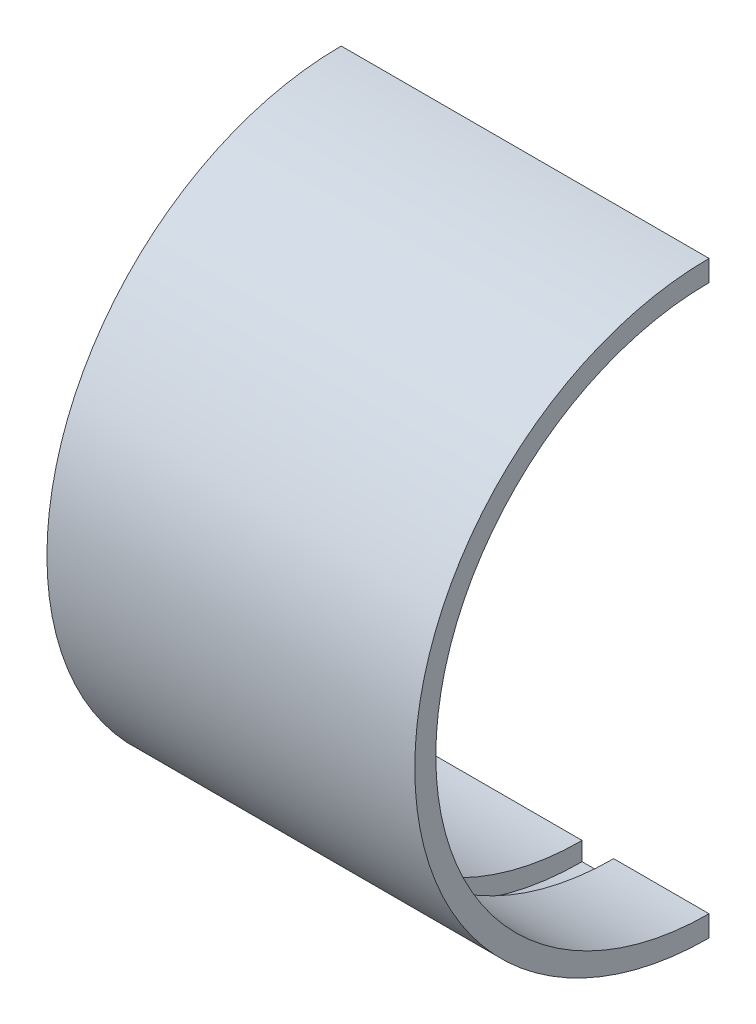
ISO-10303-21;
HEADER;
FILE_DESCRIPTION(('STEP AP214'),'2;1');
FILE_NAME('part.step','',(''),(''),'','','');
FILE_SCHEMA(('AUTOMOTIVE_DESIGN { 1 0 10303 214 1 1 1 1 }'));
ENDSEC;
DATA;
#1=APPLICATION_CONTEXT('core data for automotive mechanical design processes');
#2=APPLICATION_PROTOCOL_DEFINITION('international standard','automotive_design',2000,#1);
#3=PRODUCT_CONTEXT('',#1,'mechanical');
#4=PRODUCT('Part','Part','',(#3));
#5=PRODUCT_RELATED_PRODUCT_CATEGORY('part','',(#4));
#6=PRODUCT_DEFINITION_FORMATION('','',#4);
#7=PRODUCT_DEFINITION_CONTEXT('part definition',#1,'design');
#8=PRODUCT_DEFINITION('design','',#6,#7);
#9=PRODUCT_DEFINITION_SHAPE('','',#8);
#10=(LENGTH_UNIT() NAMED_UNIT(*) SI_UNIT(.MILLI.,.METRE.));
#11=(NAMED_UNIT(*) PLANE_ANGLE_UNIT() SI_UNIT($,.RADIAN.));
#12=(NAMED_UNIT(*) SI_UNIT($,.STERADIAN.) SOLID_ANGLE_UNIT());
#13=UNCERTAINTY_MEASURE_WITH_UNIT(LENGTH_MEASURE(1.E-05),#10,'distance_accuracy_value','');
#14=(GEOMETRIC_REPRESENTATION_CONTEXT(3) GLOBAL_UNCERTAINTY_ASSIGNED_CONTEXT((#13)) GLOBAL_UNIT_ASSIGNED_CONTEXT((#10,
#11,#12)) REPRESENTATION_CONTEXT('',''));
#15=CARTESIAN_POINT('',(0.,0.,0.));
#16=DIRECTION('',(0.,0.,1.));
#17=DIRECTION('',(1.,0.,0.));
#18=AXIS2_PLACEMENT_3D('',#15,#16,#17);
#19=CARTESIAN_POINT('',(889.,0.,0.));
#20=DIRECTION('',(-1.,0.,0.));
#21=DIRECTION('',(0.,0.,1.));
#22=AXIS2_PLACEMENT_3D('',#19,#20,#21);
#23=CYLINDRICAL_SURFACE('',#22,660.4);
#24=CARTESIAN_POINT('',(582.248938238265,0.,0.));
#25=DIRECTION('',(1.,0.,0.));
#26=DIRECTION('',(0.,0.,-1.));
#27=AXIS2_PLACEMENT_3D('',#24,#25,#26);
#28=CIRCLE('',#27,660.4);
#29=CARTESIAN_POINT('',(582.248938238265,-660.4,0.));
#30=VERTEX_POINT('',#29);
#31=CARTESIAN_POINT('',(582.248938238265,660.4,0.));
#32=VERTEX_POINT('',#31);
#33=EDGE_CURVE('E109',#30,#32,#28,.F.);
#34=ORIENTED_EDGE('',*,*,#33,.F.);
#35=DIRECTION('',(-1.,0.,0.));
#36=VECTOR('',#35,1.);
#37=CARTESIAN_POINT('',(889.,-660.4,0.));
#38=LINE('',#37,#36);
#39=CARTESIAN_POINT('',(0.,-660.4,0.));
#40=VERTEX_POINT('',#39);
#41=EDGE_CURVE('E79',#30,#40,#38,.T.);
#42=ORIENTED_EDGE('',*,*,#41,.T.);
#43=CARTESIAN_POINT('',(0.,0.,0.));
#44=DIRECTION('',(-1.,0.,0.));
#45=DIRECTION('',(0.,0.,-1.));
#46=AXIS2_PLACEMENT_3D('',#43,#44,#45);
#47=CIRCLE('',#46,660.4);
#48=CARTESIAN_POINT('',(0.,660.4,0.));
#49=VERTEX_POINT('',#48);
#50=EDGE_CURVE('E126',#40,#49,#47,.T.);
#51=ORIENTED_EDGE('',*,*,#50,.T.);
#52=DIRECTION('',(-1.,0.,0.));
#53=VECTOR('',#52,1.);
#54=CARTESIAN_POINT('',(889.,660.4,0.));
#55=LINE('',#54,#53);
#56=EDGE_CURVE('E153',#32,#49,#55,.T.);
#57=ORIENTED_EDGE('',*,*,#56,.F.);
#58=EDGE_LOOP('',(#34,#42,#51,#57));
#59=FACE_BOUND('',#58,.T.);
#60=ADVANCED_FACE('F33',(#59),#23,.F.);
#61=CARTESIAN_POINT('',(889.,-660.4,0.));
#62=VERTEX_POINT('',#61);
#63=CARTESIAN_POINT('',(658.448938238265,-660.4,0.));
#64=VERTEX_POINT('',#63);
#65=EDGE_CURVE('E144',#62,#64,#38,.T.);
#66=ORIENTED_EDGE('',*,*,#65,.T.);
#67=CARTESIAN_POINT('',(658.448938238265,0.,0.));
#68=DIRECTION('',(1.,0.,0.));
#69=DIRECTION('',(0.,0.,-1.));
#70=AXIS2_PLACEMENT_3D('',#67,#68,#69);
#71=CIRCLE('',#70,660.4);
#72=CARTESIAN_POINT('',(658.448938238265,660.4,0.));
#73=VERTEX_POINT('',#72);
#74=EDGE_CURVE('E112',#64,#73,#71,.F.);
#75=ORIENTED_EDGE('',*,*,#74,.T.);
#76=CARTESIAN_POINT('',(889.,660.4,0.));
#77=VERTEX_POINT('',#76);
#78=EDGE_CURVE('E154',#77,#73,#55,.T.);
#79=ORIENTED_EDGE('',*,*,#78,.F.);
#80=CARTESIAN_POINT('',(889.,0.,0.));
#81=DIRECTION('',(-1.,0.,0.));
#82=DIRECTION('',(0.,0.,-1.));
#83=AXIS2_PLACEMENT_3D('',#80,#81,#82);
#84=CIRCLE('',#83,660.4);
#85=EDGE_CURVE('E133',#62,#77,#84,.T.);
#86=ORIENTED_EDGE('',*,*,#85,.F.);
#87=EDGE_LOOP('',(#66,#75,#79,#86));
#88=FACE_BOUND('',#87,.T.);
#89=ADVANCED_FACE('F35',(#88),#23,.F.);
#90=CARTESIAN_POINT('',(889.,711.2,0.));
#91=DIRECTION('',(0.,0.,1.));
#92=DIRECTION('',(1.,0.,0.));
#93=AXIS2_PLACEMENT_3D('',#90,#91,#92);
#94=PLANE('',#93);
#95=ORIENTED_EDGE('',*,*,#78,.T.);
#96=DIRECTION('',(0.,1.,0.));
#97=VECTOR('',#96,1.);
#98=CARTESIAN_POINT('',(658.448938238265,711.2,0.));
#99=LINE('',#98,#97);
#100=CARTESIAN_POINT('',(658.448938238265,704.85,0.));
#101=VERTEX_POINT('',#100);
#102=EDGE_CURVE('E125',#73,#101,#99,.T.);
#103=ORIENTED_EDGE('',*,*,#102,.T.);
#104=DIRECTION('',(-1.,0.,0.));
#105=VECTOR('',#104,1.);
#106=CARTESIAN_POINT('',(658.448938238265,704.849999999999,0.));
#107=LINE('',#106,#105);
#108=CARTESIAN_POINT('',(582.248938238265,704.85,0.));
#109=VERTEX_POINT('',#108);
#110=EDGE_CURVE('E117',#109,#101,#107,.F.);
#111=ORIENTED_EDGE('',*,*,#110,.F.);
#112=DIRECTION('',(0.,1.,0.));
#113=VECTOR('',#112,1.);
#114=CARTESIAN_POINT('',(582.248938238265,711.2,0.));
#115=LINE('',#114,#113);
#116=EDGE_CURVE('E107',#32,#109,#115,.T.);
#117=ORIENTED_EDGE('',*,*,#116,.F.);
#118=ORIENTED_EDGE('',*,*,#56,.T.);
#119=DIRECTION('',(0.,1.,0.));
#120=VECTOR('',#119,1.);
#121=CARTESIAN_POINT('',(0.,711.2,0.));
#122=LINE('',#121,#120);
#123=CARTESIAN_POINT('',(0.,711.2,0.));
#124=VERTEX_POINT('',#123);
#125=EDGE_CURVE('E128',#49,#124,#122,.T.);
#126=ORIENTED_EDGE('',*,*,#125,.T.);
#127=DIRECTION('',(-1.,0.,0.));
#128=VECTOR('',#127,1.);
#129=CARTESIAN_POINT('',(889.,711.2,0.));
#130=LINE('',#129,#128);
#131=CARTESIAN_POINT('',(889.,711.2,0.));
#132=VERTEX_POINT('',#131);
#133=EDGE_CURVE('E150',#132,#124,#130,.T.);
#134=ORIENTED_EDGE('',*,*,#133,.F.);
#135=DIRECTION('',(0.,1.,0.));
#136=VECTOR('',#135,1.);
#137=CARTESIAN_POINT('',(889.,711.2,0.));
#138=LINE('',#137,#136);
#139=EDGE_CURVE('E87',#77,#132,#138,.T.);
#140=ORIENTED_EDGE('',*,*,#139,.F.);
#141=EDGE_LOOP('',(#95,#103,#111,#117,#118,#126,#134,#140));
#142=FACE_BOUND('',#141,.T.);
#143=ADVANCED_FACE('F124',(#142),#94,.F.);
#144=CARTESIAN_POINT('',(889.,0.,0.));
#145=DIRECTION('',(-1.,0.,0.));
#146=DIRECTION('',(0.,0.,1.));
#147=AXIS2_PLACEMENT_3D('',#144,#145,#146);
#148=CYLINDRICAL_SURFACE('',#147,711.2);
#149=CARTESIAN_POINT('',(0.,0.,0.));
#150=DIRECTION('',(1.,0.,0.));
#151=DIRECTION('',(0.,0.,-1.));
#152=AXIS2_PLACEMENT_3D('',#149,#150,#151);
#153=CIRCLE('',#152,711.2);
#154=CARTESIAN_POINT('',(0.,-711.2,0.));
#155=VERTEX_POINT('',#154);
#156=EDGE_CURVE('E141',#124,#155,#153,.T.);
#157=ORIENTED_EDGE('',*,*,#156,.T.);
#158=DIRECTION('',(-1.,0.,0.));
#159=VECTOR('',#158,1.);
#160=CARTESIAN_POINT('',(889.,-711.2,0.));
#161=LINE('',#160,#159);
#162=CARTESIAN_POINT('',(889.,-711.2,0.));
#163=VERTEX_POINT('',#162);
#164=EDGE_CURVE('E147',#163,#155,#161,.T.);
#165=ORIENTED_EDGE('',*,*,#164,.F.);
#166=CARTESIAN_POINT('',(889.,0.,0.));
#167=DIRECTION('',(1.,0.,0.));
#168=DIRECTION('',(0.,0.,-1.));
#169=AXIS2_PLACEMENT_3D('',#166,#167,#168);
#170=CIRCLE('',#169,711.2);
#171=EDGE_CURVE('E137',#132,#163,#170,.T.);
#172=ORIENTED_EDGE('',*,*,#171,.F.);
#173=ORIENTED_EDGE('',*,*,#133,.T.);
#174=EDGE_LOOP('',(#157,#165,#172,#173));
#175=FACE_BOUND('',#174,.T.);
#176=ADVANCED_FACE('F169',(#175),#148,.T.);
#177=CARTESIAN_POINT('',(889.,-660.4,0.));
#178=DIRECTION('',(0.,0.,1.));
#179=DIRECTION('',(1.,0.,0.));
#180=AXIS2_PLACEMENT_3D('',#177,#178,#179);
#181=PLANE('',#180);
#182=DIRECTION('',(-1.,0.,0.));
#183=VECTOR('',#182,1.);
#184=CARTESIAN_POINT('',(658.448938238265,-704.85,0.));
#185=LINE('',#184,#183);
#186=CARTESIAN_POINT('',(658.448938238265,-704.850000000001,0.));
#187=VERTEX_POINT('',#186);
#188=CARTESIAN_POINT('',(582.248938238265,-704.850000000001,0.));
#189=VERTEX_POINT('',#188);
#190=EDGE_CURVE('E41',#187,#189,#185,.T.);
#191=ORIENTED_EDGE('',*,*,#190,.F.);
#192=DIRECTION('',(0.,1.,0.));
#193=VECTOR('',#192,1.);
#194=CARTESIAN_POINT('',(658.448938238265,-660.4,0.));
#195=LINE('',#194,#193);
#196=EDGE_CURVE('E11',#187,#64,#195,.T.);
#197=ORIENTED_EDGE('',*,*,#196,.T.);
#198=ORIENTED_EDGE('',*,*,#65,.F.);
#199=DIRECTION('',(0.,1.,0.));
#200=VECTOR('',#199,1.);
#201=CARTESIAN_POINT('',(889.,-660.4,0.));
#202=LINE('',#201,#200);
#203=EDGE_CURVE('E57',#163,#62,#202,.T.);
#204=ORIENTED_EDGE('',*,*,#203,.F.);
#205=ORIENTED_EDGE('',*,*,#164,.T.);
#206=DIRECTION('',(0.,1.,0.));
#207=VECTOR('',#206,1.);
#208=CARTESIAN_POINT('',(0.,-660.4,0.));
#209=LINE('',#208,#207);
#210=EDGE_CURVE('E135',#155,#40,#209,.T.);
#211=ORIENTED_EDGE('',*,*,#210,.T.);
#212=ORIENTED_EDGE('',*,*,#41,.F.);
#213=DIRECTION('',(0.,1.,0.));
#214=VECTOR('',#213,1.);
#215=CARTESIAN_POINT('',(582.248938238265,-660.4,0.));
#216=LINE('',#215,#214);
#217=EDGE_CURVE('E156',#189,#30,#216,.T.);
#218=ORIENTED_EDGE('',*,*,#217,.F.);
#219=EDGE_LOOP('',(#191,#197,#198,#204,#205,#211,#212,#218));
#220=FACE_BOUND('',#219,.T.);
#221=ADVANCED_FACE('F159',(#220),#181,.F.);
#222=CARTESIAN_POINT('',(889.,0.,0.));
#223=DIRECTION('',(1.,0.,0.));
#224=DIRECTION('',(0.,0.,-1.));
#225=AXIS2_PLACEMENT_3D('',#222,#223,#224);
#226=PLANE('',#225);
#227=ORIENTED_EDGE('',*,*,#85,.T.);
#228=ORIENTED_EDGE('',*,*,#139,.T.);
#229=ORIENTED_EDGE('',*,*,#171,.T.);
#230=ORIENTED_EDGE('',*,*,#203,.T.);
#231=EDGE_LOOP('',(#227,#228,#229,#230));
#232=FACE_BOUND('',#231,.T.);
#233=ADVANCED_FACE('F170',(#232),#226,.T.);
#234=CARTESIAN_POINT('',(0.,0.,0.));
#235=DIRECTION('',(1.,0.,0.));
#236=DIRECTION('',(0.,0.,-1.));
#237=AXIS2_PLACEMENT_3D('',#234,#235,#236);
#238=PLANE('',#237);
#239=ORIENTED_EDGE('',*,*,#50,.F.);
#240=ORIENTED_EDGE('',*,*,#210,.F.);
#241=ORIENTED_EDGE('',*,*,#156,.F.);
#242=ORIENTED_EDGE('',*,*,#125,.F.);
#243=EDGE_LOOP('',(#239,#240,#241,#242));
#244=FACE_BOUND('',#243,.T.);
#245=ADVANCED_FACE('F166',(#244),#238,.F.);
#246=CARTESIAN_POINT('',(658.448938238265,-5.55111512312578E-13,0.));
#247=DIRECTION('',(-1.,0.,0.));
#248=DIRECTION('',(0.,0.,1.));
#249=AXIS2_PLACEMENT_3D('',#246,#247,#248);
#250=CYLINDRICAL_SURFACE('',#249,704.85);
#251=ORIENTED_EDGE('',*,*,#110,.T.);
#252=CARTESIAN_POINT('',(658.448938238265,-5.55111512312578E-13,0.));
#253=DIRECTION('',(1.,0.,0.));
#254=DIRECTION('',(0.,0.,-1.));
#255=AXIS2_PLACEMENT_3D('',#252,#253,#254);
#256=CIRCLE('',#255,704.85);
#257=EDGE_CURVE('E121',#101,#187,#256,.T.);
#258=ORIENTED_EDGE('',*,*,#257,.T.);
#259=ORIENTED_EDGE('',*,*,#190,.T.);
#260=CARTESIAN_POINT('',(582.248938238265,-5.55111512312578E-13,0.));
#261=DIRECTION('',(1.,0.,0.));
#262=DIRECTION('',(0.,0.,-1.));
#263=AXIS2_PLACEMENT_3D('',#260,#261,#262);
#264=CIRCLE('',#263,704.85);
#265=EDGE_CURVE('E48',#109,#189,#264,.T.);
#266=ORIENTED_EDGE('',*,*,#265,.F.);
#267=EDGE_LOOP('',(#251,#258,#259,#266));
#268=FACE_BOUND('',#267,.T.);
#269=ADVANCED_FACE('F115',(#268),#250,.F.);
#270=CARTESIAN_POINT('',(658.448938238265,-5.55111512312578E-13,0.));
#271=DIRECTION('',(1.,0.,0.));
#272=DIRECTION('',(0.,0.,-1.));
#273=AXIS2_PLACEMENT_3D('',#270,#271,#272);
#274=PLANE('',#273);
#275=ORIENTED_EDGE('',*,*,#74,.F.);
#276=ORIENTED_EDGE('',*,*,#196,.F.);
#277=ORIENTED_EDGE('',*,*,#257,.F.);
#278=ORIENTED_EDGE('',*,*,#102,.F.);
#279=EDGE_LOOP('',(#275,#276,#277,#278));
#280=FACE_BOUND('',#279,.T.);
#281=ADVANCED_FACE('F177',(#280),#274,.F.);
#282=CARTESIAN_POINT('',(582.248938238265,-5.55111512312578E-13,0.));
#283=DIRECTION('',(1.,0.,0.));
#284=DIRECTION('',(0.,0.,-1.));
#285=AXIS2_PLACEMENT_3D('',#282,#283,#284);
#286=PLANE('',#285);
#287=ORIENTED_EDGE('',*,*,#116,.T.);
#288=ORIENTED_EDGE('',*,*,#265,.T.);
#289=ORIENTED_EDGE('',*,*,#217,.T.);
#290=ORIENTED_EDGE('',*,*,#33,.T.);
#291=EDGE_LOOP('',(#287,#288,#289,#290));
#292=FACE_BOUND('',#291,.T.);
#293=ADVANCED_FACE('F108',(#292),#286,.T.);
#294=CLOSED_SHELL('',(#60,#89,#143,#176,#221,#233,#245,#269,#281,#293));
#295=MANIFOLD_SOLID_BREP('B2',#294);
#296=ADVANCED_BREP_SHAPE_REPRESENTATION('',(#18,#295),#14);
#297=SHAPE_DEFINITION_REPRESENTATION(#9,#296);
ENDSEC;
END-ISO-10303-21;
